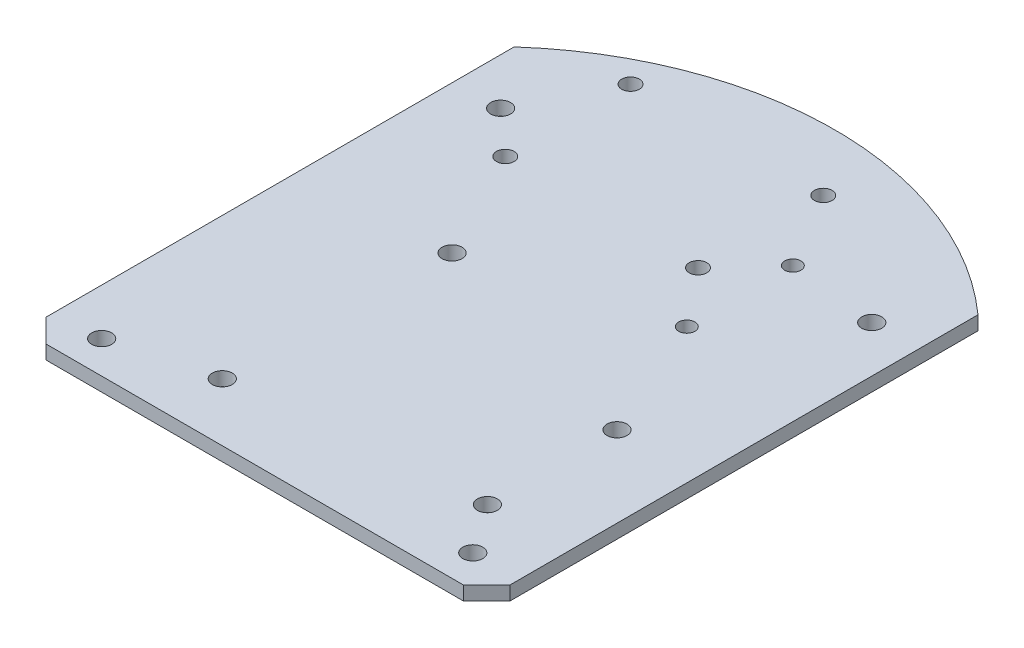
ISO-10303-21;
HEADER;
FILE_DESCRIPTION(('STEP AP214'),'2;1');
FILE_NAME('part.step','',(''),(''),'','','');
FILE_SCHEMA(('AUTOMOTIVE_DESIGN { 1 0 10303 214 1 1 1 1 }'));
ENDSEC;
DATA;
#1=APPLICATION_CONTEXT('core data for automotive mechanical design processes');
#2=APPLICATION_PROTOCOL_DEFINITION('international standard','automotive_design',2000,#1);
#3=PRODUCT_CONTEXT('',#1,'mechanical');
#4=PRODUCT('Part','Part','',(#3));
#5=PRODUCT_RELATED_PRODUCT_CATEGORY('part','',(#4));
#6=PRODUCT_DEFINITION_FORMATION('','',#4);
#7=PRODUCT_DEFINITION_CONTEXT('part definition',#1,'design');
#8=PRODUCT_DEFINITION('design','',#6,#7);
#9=PRODUCT_DEFINITION_SHAPE('','',#8);
#10=(LENGTH_UNIT() NAMED_UNIT(*) SI_UNIT(.MILLI.,.METRE.));
#11=(NAMED_UNIT(*) PLANE_ANGLE_UNIT() SI_UNIT($,.RADIAN.));
#12=(NAMED_UNIT(*) SI_UNIT($,.STERADIAN.) SOLID_ANGLE_UNIT());
#13=UNCERTAINTY_MEASURE_WITH_UNIT(LENGTH_MEASURE(1.E-05),#10,'distance_accuracy_value','');
#14=(GEOMETRIC_REPRESENTATION_CONTEXT(3) GLOBAL_UNCERTAINTY_ASSIGNED_CONTEXT((#13)) GLOBAL_UNIT_ASSIGNED_CONTEXT((#10,
#11,#12)) REPRESENTATION_CONTEXT('',''));
#15=CARTESIAN_POINT('',(0.,0.,0.));
#16=DIRECTION('',(0.,0.,1.));
#17=DIRECTION('',(1.,0.,0.));
#18=AXIS2_PLACEMENT_3D('',#15,#16,#17);
#19=CARTESIAN_POINT('',(-50.,3.,50.));
#20=DIRECTION('',(1.,0.,0.));
#21=DIRECTION('',(0.,0.,-1.));
#22=AXIS2_PLACEMENT_3D('',#19,#20,#21);
#23=PLANE('',#22);
#24=DIRECTION('',(0.,0.,1.));
#25=VECTOR('',#24,1.);
#26=CARTESIAN_POINT('',(-50.,0.,50.));
#27=LINE('',#26,#25);
#28=CARTESIAN_POINT('',(-50.,0.,-55.9016994373041));
#29=VERTEX_POINT('',#28);
#30=CARTESIAN_POINT('',(-50.,0.,45.));
#31=VERTEX_POINT('',#30);
#32=EDGE_CURVE('E138',#29,#31,#27,.T.);
#33=ORIENTED_EDGE('',*,*,#32,.T.);
#34=DIRECTION('',(0.,1.,0.));
#35=VECTOR('',#34,1.);
#36=CARTESIAN_POINT('',(-50.,3.,45.));
#37=LINE('',#36,#35);
#38=CARTESIAN_POINT('',(-50.,3.,45.));
#39=VERTEX_POINT('',#38);
#40=EDGE_CURVE('E92',#31,#39,#37,.T.);
#41=ORIENTED_EDGE('',*,*,#40,.T.);
#42=DIRECTION('',(0.,0.,1.));
#43=VECTOR('',#42,1.);
#44=CARTESIAN_POINT('',(-50.,3.,50.));
#45=LINE('',#44,#43);
#46=CARTESIAN_POINT('',(-50.,3.,-55.9016994373041));
#47=VERTEX_POINT('',#46);
#48=EDGE_CURVE('E132',#47,#39,#45,.T.);
#49=ORIENTED_EDGE('',*,*,#48,.F.);
#50=DIRECTION('',(0.,1.,0.));
#51=VECTOR('',#50,1.);
#52=CARTESIAN_POINT('',(-50.,-104.403065089049,-55.9016994373041));
#53=LINE('',#52,#51);
#54=EDGE_CURVE('E146',#29,#47,#53,.T.);
#55=ORIENTED_EDGE('',*,*,#54,.F.);
#56=EDGE_LOOP('',(#33,#41,#49,#55));
#57=FACE_BOUND('',#56,.T.);
#58=ADVANCED_FACE('F68',(#57),#23,.F.);
#59=CARTESIAN_POINT('',(50.,3.,50.));
#60=DIRECTION('',(0.,0.,-1.));
#61=DIRECTION('',(-1.,0.,0.));
#62=AXIS2_PLACEMENT_3D('',#59,#60,#61);
#63=PLANE('',#62);
#64=DIRECTION('',(1.,0.,0.));
#65=VECTOR('',#64,1.);
#66=CARTESIAN_POINT('',(50.,3.,50.));
#67=LINE('',#66,#65);
#68=CARTESIAN_POINT('',(-45.,3.,50.));
#69=VERTEX_POINT('',#68);
#70=CARTESIAN_POINT('',(45.,3.,50.));
#71=VERTEX_POINT('',#70);
#72=EDGE_CURVE('E155',#69,#71,#67,.T.);
#73=ORIENTED_EDGE('',*,*,#72,.F.);
#74=DIRECTION('',(0.,-1.,0.));
#75=VECTOR('',#74,1.);
#76=CARTESIAN_POINT('',(-45.,3.,50.));
#77=LINE('',#76,#75);
#78=CARTESIAN_POINT('',(-45.,0.,50.));
#79=VERTEX_POINT('',#78);
#80=EDGE_CURVE('E164',#69,#79,#77,.T.);
#81=ORIENTED_EDGE('',*,*,#80,.T.);
#82=DIRECTION('',(1.,0.,0.));
#83=VECTOR('',#82,1.);
#84=CARTESIAN_POINT('',(50.,0.,50.));
#85=LINE('',#84,#83);
#86=CARTESIAN_POINT('',(45.,0.,50.));
#87=VERTEX_POINT('',#86);
#88=EDGE_CURVE('E133',#79,#87,#85,.T.);
#89=ORIENTED_EDGE('',*,*,#88,.T.);
#90=DIRECTION('',(0.,1.,0.));
#91=VECTOR('',#90,1.);
#92=CARTESIAN_POINT('',(45.,3.,50.));
#93=LINE('',#92,#91);
#94=EDGE_CURVE('E159',#87,#71,#93,.T.);
#95=ORIENTED_EDGE('',*,*,#94,.T.);
#96=EDGE_LOOP('',(#73,#81,#89,#95));
#97=FACE_BOUND('',#96,.T.);
#98=ADVANCED_FACE('F178',(#97),#63,.F.);
#99=CARTESIAN_POINT('',(50.,3.,50.));
#100=DIRECTION('',(-1.,0.,0.));
#101=DIRECTION('',(0.,0.,1.));
#102=AXIS2_PLACEMENT_3D('',#99,#100,#101);
#103=PLANE('',#102);
#104=DIRECTION('',(0.,0.,-1.));
#105=VECTOR('',#104,1.);
#106=CARTESIAN_POINT('',(50.,3.,50.));
#107=LINE('',#106,#105);
#108=CARTESIAN_POINT('',(50.,3.,45.));
#109=VERTEX_POINT('',#108);
#110=CARTESIAN_POINT('',(50.,3.,-55.9016994373041));
#111=VERTEX_POINT('',#110);
#112=EDGE_CURVE('E157',#109,#111,#107,.T.);
#113=ORIENTED_EDGE('',*,*,#112,.F.);
#114=DIRECTION('',(0.,-1.,0.));
#115=VECTOR('',#114,1.);
#116=CARTESIAN_POINT('',(50.,3.,45.));
#117=LINE('',#116,#115);
#118=CARTESIAN_POINT('',(50.,0.,45.));
#119=VERTEX_POINT('',#118);
#120=EDGE_CURVE('E12',#109,#119,#117,.T.);
#121=ORIENTED_EDGE('',*,*,#120,.T.);
#122=DIRECTION('',(0.,0.,-1.));
#123=VECTOR('',#122,1.);
#124=CARTESIAN_POINT('',(50.,0.,50.));
#125=LINE('',#124,#123);
#126=CARTESIAN_POINT('',(50.,0.,-55.9016994373041));
#127=VERTEX_POINT('',#126);
#128=EDGE_CURVE('E124',#119,#127,#125,.T.);
#129=ORIENTED_EDGE('',*,*,#128,.T.);
#130=DIRECTION('',(0.,1.,0.));
#131=VECTOR('',#130,1.);
#132=CARTESIAN_POINT('',(50.,-104.403065089049,-55.9016994373041));
#133=LINE('',#132,#131);
#134=EDGE_CURVE('E128',#127,#111,#133,.T.);
#135=ORIENTED_EDGE('',*,*,#134,.T.);
#136=EDGE_LOOP('',(#113,#121,#129,#135));
#137=FACE_BOUND('',#136,.T.);
#138=ADVANCED_FACE('F126',(#137),#103,.F.);
#139=CARTESIAN_POINT('',(0.,3.,0.));
#140=DIRECTION('',(0.,1.,0.));
#141=DIRECTION('',(0.,0.,1.));
#142=AXIS2_PLACEMENT_3D('',#139,#140,#141);
#143=PLANE('',#142);
#144=CARTESIAN_POINT('',(20.8552200520717,3.,-45.1290611241877));
#145=DIRECTION('',(0.,1.,0.));
#146=DIRECTION('',(0.,0.,1.));
#147=AXIS2_PLACEMENT_3D('',#144,#145,#146);
#148=CIRCLE('',#147,1.75);
#149=CARTESIAN_POINT('',(20.8552200520717,3.,-43.3790611241877));
#150=VERTEX_POINT('',#149);
#151=EDGE_CURVE('E256',#150,#150,#148,.T.);
#152=ORIENTED_EDGE('',*,*,#151,.F.);
#153=EDGE_LOOP('',(#152));
#154=FACE_BOUND('',#153,.T.);
#155=CARTESIAN_POINT('',(20.8341093585457,3.,-22.2973617608194));
#156=DIRECTION('',(0.,1.,0.));
#157=DIRECTION('',(0.,0.,1.));
#158=AXIS2_PLACEMENT_3D('',#155,#156,#157);
#159=CIRCLE('',#158,1.75);
#160=CARTESIAN_POINT('',(20.8341093585457,3.,-20.5473617608194));
#161=VERTEX_POINT('',#160);
#162=EDGE_CURVE('E253',#161,#161,#159,.T.);
#163=ORIENTED_EDGE('',*,*,#162,.F.);
#164=EDGE_LOOP('',(#163));
#165=FACE_BOUND('',#164,.T.);
#166=CARTESIAN_POINT('',(32.57,3.,4.47999999999998));
#167=DIRECTION('',(0.,1.,0.));
#168=DIRECTION('',(0.,0.,1.));
#169=AXIS2_PLACEMENT_3D('',#166,#167,#168);
#170=CIRCLE('',#169,2.15000000000001);
#171=CARTESIAN_POINT('',(32.57,3.,6.62999999999999));
#172=VERTEX_POINT('',#171);
#173=EDGE_CURVE('E215',#172,#172,#170,.T.);
#174=ORIENTED_EDGE('',*,*,#173,.F.);
#175=EDGE_LOOP('',(#174));
#176=FACE_BOUND('',#175,.T.);
#177=CARTESIAN_POINT('',(32.57,3.,32.42));
#178=DIRECTION('',(0.,1.,0.));
#179=DIRECTION('',(0.,0.,1.));
#180=AXIS2_PLACEMENT_3D('',#177,#178,#179);
#181=CIRCLE('',#180,2.15000000000001);
#182=CARTESIAN_POINT('',(32.57,3.,34.57));
#183=VERTEX_POINT('',#182);
#184=EDGE_CURVE('E214',#183,#183,#181,.T.);
#185=ORIENTED_EDGE('',*,*,#184,.F.);
#186=EDGE_LOOP('',(#185));
#187=FACE_BOUND('',#186,.T.);
#188=CARTESIAN_POINT('',(40.,3.,43.));
#189=DIRECTION('',(0.,1.,0.));
#190=DIRECTION('',(0.,0.,1.));
#191=AXIS2_PLACEMENT_3D('',#188,#189,#190);
#192=CIRCLE('',#191,2.15000000000001);
#193=CARTESIAN_POINT('',(40.,3.,45.15));
#194=VERTEX_POINT('',#193);
#195=EDGE_CURVE('E222',#194,#194,#192,.T.);
#196=ORIENTED_EDGE('',*,*,#195,.F.);
#197=EDGE_LOOP('',(#196));
#198=FACE_BOUND('',#197,.T.);
#199=CARTESIAN_POINT('',(-40.,3.,43.));
#200=DIRECTION('',(0.,1.,0.));
#201=DIRECTION('',(0.,0.,1.));
#202=AXIS2_PLACEMENT_3D('',#199,#200,#201);
#203=CIRCLE('',#202,2.15000000000001);
#204=CARTESIAN_POINT('',(-40.,3.,45.15));
#205=VERTEX_POINT('',#204);
#206=EDGE_CURVE('E228',#205,#205,#203,.T.);
#207=ORIENTED_EDGE('',*,*,#206,.F.);
#208=EDGE_LOOP('',(#207));
#209=FACE_BOUND('',#208,.T.);
#210=CARTESIAN_POINT('',(-19.5,3.,37.5));
#211=DIRECTION('',(0.,1.,0.));
#212=DIRECTION('',(0.,0.,1.));
#213=AXIS2_PLACEMENT_3D('',#210,#211,#212);
#214=CIRCLE('',#213,2.15);
#215=CARTESIAN_POINT('',(-19.5,3.,39.65));
#216=VERTEX_POINT('',#215);
#217=EDGE_CURVE('E191',#216,#216,#214,.T.);
#218=ORIENTED_EDGE('',*,*,#217,.F.);
#219=EDGE_LOOP('',(#218));
#220=FACE_BOUND('',#219,.T.);
#221=CARTESIAN_POINT('',(-18.23,3.,-10.76));
#222=DIRECTION('',(0.,1.,0.));
#223=DIRECTION('',(0.,0.,1.));
#224=AXIS2_PLACEMENT_3D('',#221,#222,#223);
#225=CIRCLE('',#224,2.15);
#226=CARTESIAN_POINT('',(-18.23,3.,-8.61000000000002));
#227=VERTEX_POINT('',#226);
#228=EDGE_CURVE('E190',#227,#227,#225,.T.);
#229=ORIENTED_EDGE('',*,*,#228,.F.);
#230=EDGE_LOOP('',(#229));
#231=FACE_BOUND('',#230,.T.);
#232=CARTESIAN_POINT('',(-30.500000000207,3.,-34.5000000000003));
#233=DIRECTION('',(0.,1.,0.));
#234=DIRECTION('',(0.,0.,1.));
#235=AXIS2_PLACEMENT_3D('',#232,#233,#234);
#236=CIRCLE('',#235,1.9);
#237=CARTESIAN_POINT('',(-30.500000000207,3.,-32.6000000000003));
#238=VERTEX_POINT('',#237);
#239=EDGE_CURVE('E198',#238,#238,#236,.T.);
#240=ORIENTED_EDGE('',*,*,#239,.F.);
#241=EDGE_LOOP('',(#240));
#242=FACE_BOUND('',#241,.T.);
#243=CARTESIAN_POINT('',(-30.500000000207,3.,-61.5000000000003));
#244=DIRECTION('',(0.,1.,0.));
#245=DIRECTION('',(0.,0.,1.));
#246=AXIS2_PLACEMENT_3D('',#243,#244,#245);
#247=CIRCLE('',#246,1.9);
#248=CARTESIAN_POINT('',(-30.500000000207,3.,-59.6000000000003));
#249=VERTEX_POINT('',#248);
#250=EDGE_CURVE('E204',#249,#249,#247,.T.);
#251=ORIENTED_EDGE('',*,*,#250,.F.);
#252=EDGE_LOOP('',(#251));
#253=FACE_BOUND('',#252,.T.);
#254=CARTESIAN_POINT('',(40.,3.,-43.));
#255=DIRECTION('',(0.,1.,0.));
#256=DIRECTION('',(0.,0.,1.));
#257=AXIS2_PLACEMENT_3D('',#254,#255,#256);
#258=CIRCLE('',#257,2.15000000000001);
#259=CARTESIAN_POINT('',(40.,3.,-40.85));
#260=VERTEX_POINT('',#259);
#261=EDGE_CURVE('E246',#260,#260,#258,.T.);
#262=ORIENTED_EDGE('',*,*,#261,.F.);
#263=EDGE_LOOP('',(#262));
#264=FACE_BOUND('',#263,.T.);
#265=CARTESIAN_POINT('',(11.049999999793,3.,-34.5000000000003));
#266=DIRECTION('',(0.,1.,0.));
#267=DIRECTION('',(0.,0.,1.));
#268=AXIS2_PLACEMENT_3D('',#265,#266,#267);
#269=CIRCLE('',#268,1.9);
#270=CARTESIAN_POINT('',(11.049999999793,3.,-32.6000000000003));
#271=VERTEX_POINT('',#270);
#272=EDGE_CURVE('E238',#271,#271,#269,.T.);
#273=ORIENTED_EDGE('',*,*,#272,.F.);
#274=EDGE_LOOP('',(#273));
#275=FACE_BOUND('',#274,.T.);
#276=CARTESIAN_POINT('',(11.049999999793,3.,-61.5000000000003));
#277=DIRECTION('',(0.,1.,0.));
#278=DIRECTION('',(0.,0.,1.));
#279=AXIS2_PLACEMENT_3D('',#276,#277,#278);
#280=CIRCLE('',#279,1.9);
#281=CARTESIAN_POINT('',(11.049999999793,3.,-59.6000000000003));
#282=VERTEX_POINT('',#281);
#283=EDGE_CURVE('E239',#282,#282,#280,.T.);
#284=ORIENTED_EDGE('',*,*,#283,.F.);
#285=EDGE_LOOP('',(#284));
#286=FACE_BOUND('',#285,.T.);
#287=CARTESIAN_POINT('',(-40.,3.,-43.));
#288=DIRECTION('',(0.,1.,0.));
#289=DIRECTION('',(0.,0.,1.));
#290=AXIS2_PLACEMENT_3D('',#287,#288,#289);
#291=CIRCLE('',#290,2.15000000000001);
#292=CARTESIAN_POINT('',(-40.,3.,-40.85));
#293=VERTEX_POINT('',#292);
#294=EDGE_CURVE('E151',#293,#293,#291,.T.);
#295=ORIENTED_EDGE('',*,*,#294,.F.);
#296=EDGE_LOOP('',(#295));
#297=FACE_BOUND('',#296,.T.);
#298=ORIENTED_EDGE('',*,*,#48,.T.);
#299=DIRECTION('',(-0.707106781186547,0.,-0.707106781186549));
#300=VECTOR('',#299,1.);
#301=CARTESIAN_POINT('',(-47.5000000000001,3.,47.4999999999999));
#302=LINE('',#301,#300);
#303=EDGE_CURVE('E77',#39,#69,#302,.F.);
#304=ORIENTED_EDGE('',*,*,#303,.T.);
#305=ORIENTED_EDGE('',*,*,#72,.T.);
#306=DIRECTION('',(-0.707106781186549,0.,0.707106781186547));
#307=VECTOR('',#306,1.);
#308=CARTESIAN_POINT('',(47.4999999999999,3.,47.5000000000001));
#309=LINE('',#308,#307);
#310=EDGE_CURVE('E84',#71,#109,#309,.F.);
#311=ORIENTED_EDGE('',*,*,#310,.T.);
#312=ORIENTED_EDGE('',*,*,#112,.T.);
#313=CARTESIAN_POINT('',(0.,3.,2.11983208764366E-10));
#314=DIRECTION('',(0.,1.,0.));
#315=DIRECTION('',(0.,0.,1.));
#316=AXIS2_PLACEMENT_3D('',#313,#314,#315);
#317=CIRCLE('',#316,75.0000000000159);
#318=EDGE_CURVE('E142',#111,#47,#317,.T.);
#319=ORIENTED_EDGE('',*,*,#318,.T.);
#320=EDGE_LOOP('',(#298,#304,#305,#311,#312,#319));
#321=FACE_BOUND('',#320,.T.);
#322=ADVANCED_FACE('F174',(#154,#165,#176,#187,#198,#209,#220,#231,#242,#253,#264,#275,#286,
#297,#321),#143,.T.);
#323=CARTESIAN_POINT('',(0.,0.,0.));
#324=DIRECTION('',(0.,1.,0.));
#325=DIRECTION('',(0.,0.,1.));
#326=AXIS2_PLACEMENT_3D('',#323,#324,#325);
#327=PLANE('',#326);
#328=CARTESIAN_POINT('',(20.8552200520717,0.,-45.1290611241877));
#329=DIRECTION('',(0.,1.,0.));
#330=DIRECTION('',(0.,0.,1.));
#331=AXIS2_PLACEMENT_3D('',#328,#329,#330);
#332=CIRCLE('',#331,1.75);
#333=CARTESIAN_POINT('',(20.8552200520717,0.,-43.3790611241877));
#334=VERTEX_POINT('',#333);
#335=EDGE_CURVE('E242',#334,#334,#332,.F.);
#336=ORIENTED_EDGE('',*,*,#335,.F.);
#337=EDGE_LOOP('',(#336));
#338=FACE_BOUND('',#337,.T.);
#339=CARTESIAN_POINT('',(20.8341093585457,0.,-22.2973617608194));
#340=DIRECTION('',(0.,1.,0.));
#341=DIRECTION('',(0.,0.,1.));
#342=AXIS2_PLACEMENT_3D('',#339,#340,#341);
#343=CIRCLE('',#342,1.75);
#344=CARTESIAN_POINT('',(20.8341093585457,0.,-20.5473617608194));
#345=VERTEX_POINT('',#344);
#346=EDGE_CURVE('E257',#345,#345,#343,.F.);
#347=ORIENTED_EDGE('',*,*,#346,.F.);
#348=EDGE_LOOP('',(#347));
#349=FACE_BOUND('',#348,.T.);
#350=CARTESIAN_POINT('',(32.57,0.,4.47999999999998));
#351=DIRECTION('',(0.,1.,0.));
#352=DIRECTION('',(0.,0.,1.));
#353=AXIS2_PLACEMENT_3D('',#350,#351,#352);
#354=CIRCLE('',#353,2.15000000000001);
#355=CARTESIAN_POINT('',(32.57,0.,6.62999999999999));
#356=VERTEX_POINT('',#355);
#357=EDGE_CURVE('E211',#356,#356,#354,.F.);
#358=ORIENTED_EDGE('',*,*,#357,.F.);
#359=EDGE_LOOP('',(#358));
#360=FACE_BOUND('',#359,.T.);
#361=CARTESIAN_POINT('',(32.57,0.,32.42));
#362=DIRECTION('',(0.,1.,0.));
#363=DIRECTION('',(0.,0.,1.));
#364=AXIS2_PLACEMENT_3D('',#361,#362,#363);
#365=CIRCLE('',#364,2.15000000000001);
#366=CARTESIAN_POINT('',(32.57,0.,34.57));
#367=VERTEX_POINT('',#366);
#368=EDGE_CURVE('E219',#367,#367,#365,.F.);
#369=ORIENTED_EDGE('',*,*,#368,.F.);
#370=EDGE_LOOP('',(#369));
#371=FACE_BOUND('',#370,.T.);
#372=CARTESIAN_POINT('',(40.,0.,43.));
#373=DIRECTION('',(0.,1.,0.));
#374=DIRECTION('',(0.,0.,1.));
#375=AXIS2_PLACEMENT_3D('',#372,#373,#374);
#376=CIRCLE('',#375,2.15000000000001);
#377=CARTESIAN_POINT('',(40.,0.,45.15));
#378=VERTEX_POINT('',#377);
#379=EDGE_CURVE('E225',#378,#378,#376,.F.);
#380=ORIENTED_EDGE('',*,*,#379,.F.);
#381=EDGE_LOOP('',(#380));
#382=FACE_BOUND('',#381,.T.);
#383=CARTESIAN_POINT('',(-40.,0.,43.));
#384=DIRECTION('',(0.,1.,0.));
#385=DIRECTION('',(0.,0.,1.));
#386=AXIS2_PLACEMENT_3D('',#383,#384,#385);
#387=CIRCLE('',#386,2.15000000000001);
#388=CARTESIAN_POINT('',(-40.,0.,45.15));
#389=VERTEX_POINT('',#388);
#390=EDGE_CURVE('E194',#389,#389,#387,.F.);
#391=ORIENTED_EDGE('',*,*,#390,.F.);
#392=EDGE_LOOP('',(#391));
#393=FACE_BOUND('',#392,.T.);
#394=CARTESIAN_POINT('',(-19.5,0.,37.5));
#395=DIRECTION('',(0.,1.,0.));
#396=DIRECTION('',(0.,0.,1.));
#397=AXIS2_PLACEMENT_3D('',#394,#395,#396);
#398=CIRCLE('',#397,2.15);
#399=CARTESIAN_POINT('',(-19.5,0.,39.65));
#400=VERTEX_POINT('',#399);
#401=EDGE_CURVE('E187',#400,#400,#398,.F.);
#402=ORIENTED_EDGE('',*,*,#401,.F.);
#403=EDGE_LOOP('',(#402));
#404=FACE_BOUND('',#403,.T.);
#405=CARTESIAN_POINT('',(-18.23,0.,-10.76));
#406=DIRECTION('',(0.,1.,0.));
#407=DIRECTION('',(0.,0.,1.));
#408=AXIS2_PLACEMENT_3D('',#405,#406,#407);
#409=CIRCLE('',#408,2.15);
#410=CARTESIAN_POINT('',(-18.23,0.,-8.61000000000002));
#411=VERTEX_POINT('',#410);
#412=EDGE_CURVE('E195',#411,#411,#409,.F.);
#413=ORIENTED_EDGE('',*,*,#412,.F.);
#414=EDGE_LOOP('',(#413));
#415=FACE_BOUND('',#414,.T.);
#416=CARTESIAN_POINT('',(-30.500000000207,0.,-34.5000000000003));
#417=DIRECTION('',(0.,1.,0.));
#418=DIRECTION('',(0.,0.,1.));
#419=AXIS2_PLACEMENT_3D('',#416,#417,#418);
#420=CIRCLE('',#419,1.9);
#421=CARTESIAN_POINT('',(-30.500000000207,0.,-32.6000000000003));
#422=VERTEX_POINT('',#421);
#423=EDGE_CURVE('E201',#422,#422,#420,.F.);
#424=ORIENTED_EDGE('',*,*,#423,.F.);
#425=EDGE_LOOP('',(#424));
#426=FACE_BOUND('',#425,.T.);
#427=CARTESIAN_POINT('',(-30.500000000207,0.,-61.5000000000003));
#428=DIRECTION('',(0.,1.,0.));
#429=DIRECTION('',(0.,0.,1.));
#430=AXIS2_PLACEMENT_3D('',#427,#428,#429);
#431=CIRCLE('',#430,1.9);
#432=CARTESIAN_POINT('',(-30.500000000207,0.,-59.6000000000003));
#433=VERTEX_POINT('',#432);
#434=EDGE_CURVE('E186',#433,#433,#431,.F.);
#435=ORIENTED_EDGE('',*,*,#434,.F.);
#436=EDGE_LOOP('',(#435));
#437=FACE_BOUND('',#436,.T.);
#438=CARTESIAN_POINT('',(40.,0.,-43.));
#439=DIRECTION('',(0.,1.,0.));
#440=DIRECTION('',(0.,0.,1.));
#441=AXIS2_PLACEMENT_3D('',#438,#439,#440);
#442=CIRCLE('',#441,2.15000000000001);
#443=CARTESIAN_POINT('',(40.,0.,-40.85));
#444=VERTEX_POINT('',#443);
#445=EDGE_CURVE('E218',#444,#444,#442,.F.);
#446=ORIENTED_EDGE('',*,*,#445,.F.);
#447=EDGE_LOOP('',(#446));
#448=FACE_BOUND('',#447,.T.);
#449=CARTESIAN_POINT('',(11.049999999793,0.,-34.5000000000003));
#450=DIRECTION('',(0.,1.,0.));
#451=DIRECTION('',(0.,0.,1.));
#452=AXIS2_PLACEMENT_3D('',#449,#450,#451);
#453=CIRCLE('',#452,1.9);
#454=CARTESIAN_POINT('',(11.049999999793,0.,-32.6000000000003));
#455=VERTEX_POINT('',#454);
#456=EDGE_CURVE('E243',#455,#455,#453,.F.);
#457=ORIENTED_EDGE('',*,*,#456,.F.);
#458=EDGE_LOOP('',(#457));
#459=FACE_BOUND('',#458,.T.);
#460=CARTESIAN_POINT('',(11.049999999793,0.,-61.5000000000003));
#461=DIRECTION('',(0.,1.,0.));
#462=DIRECTION('',(0.,0.,1.));
#463=AXIS2_PLACEMENT_3D('',#460,#461,#462);
#464=CIRCLE('',#463,1.9);
#465=CARTESIAN_POINT('',(11.049999999793,0.,-59.6000000000003));
#466=VERTEX_POINT('',#465);
#467=EDGE_CURVE('E235',#466,#466,#464,.F.);
#468=ORIENTED_EDGE('',*,*,#467,.F.);
#469=EDGE_LOOP('',(#468));
#470=FACE_BOUND('',#469,.T.);
#471=CARTESIAN_POINT('',(-40.,0.,-43.));
#472=DIRECTION('',(0.,1.,0.));
#473=DIRECTION('',(0.,0.,1.));
#474=AXIS2_PLACEMENT_3D('',#471,#472,#473);
#475=CIRCLE('',#474,2.15000000000001);
#476=CARTESIAN_POINT('',(-40.,0.,-40.85));
#477=VERTEX_POINT('',#476);
#478=EDGE_CURVE('E147',#477,#477,#475,.F.);
#479=ORIENTED_EDGE('',*,*,#478,.F.);
#480=EDGE_LOOP('',(#479));
#481=FACE_BOUND('',#480,.T.);
#482=CARTESIAN_POINT('',(0.,0.,2.11983208764366E-10));
#483=DIRECTION('',(0.,1.,0.));
#484=DIRECTION('',(0.,0.,1.));
#485=AXIS2_PLACEMENT_3D('',#482,#483,#484);
#486=CIRCLE('',#485,75.0000000000159);
#487=EDGE_CURVE('E136',#29,#127,#486,.F.);
#488=ORIENTED_EDGE('',*,*,#487,.T.);
#489=ORIENTED_EDGE('',*,*,#128,.F.);
#490=DIRECTION('',(0.707106781186549,0.,-0.707106781186547));
#491=VECTOR('',#490,1.);
#492=CARTESIAN_POINT('',(50.,0.,45.));
#493=LINE('',#492,#491);
#494=EDGE_CURVE('E167',#119,#87,#493,.F.);
#495=ORIENTED_EDGE('',*,*,#494,.T.);
#496=ORIENTED_EDGE('',*,*,#88,.F.);
#497=DIRECTION('',(0.707106781186547,0.,0.707106781186549));
#498=VECTOR('',#497,1.);
#499=CARTESIAN_POINT('',(-45.,0.,50.));
#500=LINE('',#499,#498);
#501=EDGE_CURVE('E169',#79,#31,#500,.F.);
#502=ORIENTED_EDGE('',*,*,#501,.T.);
#503=ORIENTED_EDGE('',*,*,#32,.F.);
#504=EDGE_LOOP('',(#488,#489,#495,#496,#502,#503));
#505=FACE_BOUND('',#504,.T.);
#506=ADVANCED_FACE('F137',(#338,#349,#360,#371,#382,#393,#404,#415,#426,#437,#448,#459,#470,
#481,#505),#327,.F.);
#507=CARTESIAN_POINT('',(-45.,3.,50.));
#508=DIRECTION('',(0.707106781186548,0.,-0.707106781186546));
#509=DIRECTION('',(0.,-1.,0.));
#510=AXIS2_PLACEMENT_3D('',#507,#508,#509);
#511=PLANE('',#510);
#512=ORIENTED_EDGE('',*,*,#303,.F.);
#513=ORIENTED_EDGE('',*,*,#40,.F.);
#514=ORIENTED_EDGE('',*,*,#501,.F.);
#515=ORIENTED_EDGE('',*,*,#80,.F.);
#516=EDGE_LOOP('',(#512,#513,#514,#515));
#517=FACE_BOUND('',#516,.T.);
#518=ADVANCED_FACE('F181',(#517),#511,.F.);
#519=CARTESIAN_POINT('',(50.,3.,45.));
#520=DIRECTION('',(-0.707106781186546,0.,-0.707106781186548));
#521=DIRECTION('',(0.,-1.,0.));
#522=AXIS2_PLACEMENT_3D('',#519,#520,#521);
#523=PLANE('',#522);
#524=ORIENTED_EDGE('',*,*,#310,.F.);
#525=ORIENTED_EDGE('',*,*,#94,.F.);
#526=ORIENTED_EDGE('',*,*,#494,.F.);
#527=ORIENTED_EDGE('',*,*,#120,.F.);
#528=EDGE_LOOP('',(#524,#525,#526,#527));
#529=FACE_BOUND('',#528,.T.);
#530=ADVANCED_FACE('F71',(#529),#523,.F.);
#531=CARTESIAN_POINT('',(0.,-104.403065089049,2.11983208764366E-10));
#532=DIRECTION('',(0.,1.,0.));
#533=DIRECTION('',(0.,0.,1.));
#534=AXIS2_PLACEMENT_3D('',#531,#532,#533);
#535=CYLINDRICAL_SURFACE('',#534,75.0000000000159);
#536=ORIENTED_EDGE('',*,*,#487,.F.);
#537=ORIENTED_EDGE('',*,*,#54,.T.);
#538=ORIENTED_EDGE('',*,*,#318,.F.);
#539=ORIENTED_EDGE('',*,*,#134,.F.);
#540=EDGE_LOOP('',(#536,#537,#538,#539));
#541=FACE_BOUND('',#540,.T.);
#542=ADVANCED_FACE('F144',(#541),#535,.T.);
#543=CARTESIAN_POINT('',(-40.,-6.08111831820433,-43.));
#544=DIRECTION('',(0.,1.,0.));
#545=DIRECTION('',(0.,0.,1.));
#546=AXIS2_PLACEMENT_3D('',#543,#544,#545);
#547=CYLINDRICAL_SURFACE('',#546,2.15000000000001);
#548=ORIENTED_EDGE('',*,*,#478,.T.);
#549=EDGE_LOOP('',(#548));
#550=FACE_BOUND('',#549,.T.);
#551=ORIENTED_EDGE('',*,*,#294,.T.);
#552=EDGE_LOOP('',(#551));
#553=FACE_BOUND('',#552,.T.);
#554=ADVANCED_FACE('F296',(#550,#553),#547,.F.);
#555=CARTESIAN_POINT('',(11.049999999793,-6.08111831820433,-61.5000000000003));
#556=DIRECTION('',(0.,1.,0.));
#557=DIRECTION('',(0.,0.,1.));
#558=AXIS2_PLACEMENT_3D('',#555,#556,#557);
#559=CYLINDRICAL_SURFACE('',#558,1.9);
#560=ORIENTED_EDGE('',*,*,#467,.T.);
#561=EDGE_LOOP('',(#560));
#562=FACE_BOUND('',#561,.T.);
#563=ORIENTED_EDGE('',*,*,#283,.T.);
#564=EDGE_LOOP('',(#563));
#565=FACE_BOUND('',#564,.T.);
#566=ADVANCED_FACE('F298',(#562,#565),#559,.F.);
#567=CARTESIAN_POINT('',(11.049999999793,-6.08111831820433,-34.5000000000003));
#568=DIRECTION('',(0.,1.,0.));
#569=DIRECTION('',(0.,0.,1.));
#570=AXIS2_PLACEMENT_3D('',#567,#568,#569);
#571=CYLINDRICAL_SURFACE('',#570,1.9);
#572=ORIENTED_EDGE('',*,*,#456,.T.);
#573=EDGE_LOOP('',(#572));
#574=FACE_BOUND('',#573,.T.);
#575=ORIENTED_EDGE('',*,*,#272,.T.);
#576=EDGE_LOOP('',(#575));
#577=FACE_BOUND('',#576,.T.);
#578=ADVANCED_FACE('F305',(#574,#577),#571,.F.);
#579=CARTESIAN_POINT('',(40.,-6.08111831820433,-43.));
#580=DIRECTION('',(0.,1.,0.));
#581=DIRECTION('',(0.,0.,1.));
#582=AXIS2_PLACEMENT_3D('',#579,#580,#581);
#583=CYLINDRICAL_SURFACE('',#582,2.15000000000001);
#584=ORIENTED_EDGE('',*,*,#445,.T.);
#585=EDGE_LOOP('',(#584));
#586=FACE_BOUND('',#585,.T.);
#587=ORIENTED_EDGE('',*,*,#261,.T.);
#588=EDGE_LOOP('',(#587));
#589=FACE_BOUND('',#588,.T.);
#590=ADVANCED_FACE('F379',(#586,#589),#583,.F.);
#591=CARTESIAN_POINT('',(-30.500000000207,-6.08111831820433,-61.5000000000003));
#592=DIRECTION('',(0.,1.,0.));
#593=DIRECTION('',(0.,0.,1.));
#594=AXIS2_PLACEMENT_3D('',#591,#592,#593);
#595=CYLINDRICAL_SURFACE('',#594,1.9);
#596=ORIENTED_EDGE('',*,*,#434,.T.);
#597=EDGE_LOOP('',(#596));
#598=FACE_BOUND('',#597,.T.);
#599=ORIENTED_EDGE('',*,*,#250,.T.);
#600=EDGE_LOOP('',(#599));
#601=FACE_BOUND('',#600,.T.);
#602=ADVANCED_FACE('F382',(#598,#601),#595,.F.);
#603=CARTESIAN_POINT('',(-30.500000000207,-6.08111831820433,-34.5000000000003));
#604=DIRECTION('',(0.,1.,0.));
#605=DIRECTION('',(0.,0.,1.));
#606=AXIS2_PLACEMENT_3D('',#603,#604,#605);
#607=CYLINDRICAL_SURFACE('',#606,1.9);
#608=ORIENTED_EDGE('',*,*,#423,.T.);
#609=EDGE_LOOP('',(#608));
#610=FACE_BOUND('',#609,.T.);
#611=ORIENTED_EDGE('',*,*,#239,.T.);
#612=EDGE_LOOP('',(#611));
#613=FACE_BOUND('',#612,.T.);
#614=ADVANCED_FACE('F404',(#610,#613),#607,.F.);
#615=CARTESIAN_POINT('',(-18.23,-6.08111831820433,-10.76));
#616=DIRECTION('',(0.,1.,0.));
#617=DIRECTION('',(0.,0.,1.));
#618=AXIS2_PLACEMENT_3D('',#615,#616,#617);
#619=CYLINDRICAL_SURFACE('',#618,2.15);
#620=ORIENTED_EDGE('',*,*,#412,.T.);
#621=EDGE_LOOP('',(#620));
#622=FACE_BOUND('',#621,.T.);
#623=ORIENTED_EDGE('',*,*,#228,.T.);
#624=EDGE_LOOP('',(#623));
#625=FACE_BOUND('',#624,.T.);
#626=ADVANCED_FACE('F408',(#622,#625),#619,.F.);
#627=CARTESIAN_POINT('',(-19.5,-6.08111831820433,37.5));
#628=DIRECTION('',(0.,1.,0.));
#629=DIRECTION('',(0.,0.,1.));
#630=AXIS2_PLACEMENT_3D('',#627,#628,#629);
#631=CYLINDRICAL_SURFACE('',#630,2.15);
#632=ORIENTED_EDGE('',*,*,#401,.T.);
#633=EDGE_LOOP('',(#632));
#634=FACE_BOUND('',#633,.T.);
#635=ORIENTED_EDGE('',*,*,#217,.T.);
#636=EDGE_LOOP('',(#635));
#637=FACE_BOUND('',#636,.T.);
#638=ADVANCED_FACE('F391',(#634,#637),#631,.F.);
#639=CARTESIAN_POINT('',(-40.,-6.08111831820433,43.));
#640=DIRECTION('',(0.,1.,0.));
#641=DIRECTION('',(0.,0.,1.));
#642=AXIS2_PLACEMENT_3D('',#639,#640,#641);
#643=CYLINDRICAL_SURFACE('',#642,2.15000000000001);
#644=ORIENTED_EDGE('',*,*,#390,.T.);
#645=EDGE_LOOP('',(#644));
#646=FACE_BOUND('',#645,.T.);
#647=ORIENTED_EDGE('',*,*,#206,.T.);
#648=EDGE_LOOP('',(#647));
#649=FACE_BOUND('',#648,.T.);
#650=ADVANCED_FACE('F387',(#646,#649),#643,.F.);
#651=CARTESIAN_POINT('',(40.,-6.08111831820433,43.));
#652=DIRECTION('',(0.,1.,0.));
#653=DIRECTION('',(0.,0.,1.));
#654=AXIS2_PLACEMENT_3D('',#651,#652,#653);
#655=CYLINDRICAL_SURFACE('',#654,2.15000000000001);
#656=ORIENTED_EDGE('',*,*,#379,.T.);
#657=EDGE_LOOP('',(#656));
#658=FACE_BOUND('',#657,.T.);
#659=ORIENTED_EDGE('',*,*,#195,.T.);
#660=EDGE_LOOP('',(#659));
#661=FACE_BOUND('',#660,.T.);
#662=ADVANCED_FACE('F390',(#658,#661),#655,.F.);
#663=CARTESIAN_POINT('',(32.57,-6.08111831820433,32.42));
#664=DIRECTION('',(0.,1.,0.));
#665=DIRECTION('',(0.,0.,1.));
#666=AXIS2_PLACEMENT_3D('',#663,#664,#665);
#667=CYLINDRICAL_SURFACE('',#666,2.15000000000001);
#668=ORIENTED_EDGE('',*,*,#368,.T.);
#669=EDGE_LOOP('',(#668));
#670=FACE_BOUND('',#669,.T.);
#671=ORIENTED_EDGE('',*,*,#184,.T.);
#672=EDGE_LOOP('',(#671));
#673=FACE_BOUND('',#672,.T.);
#674=ADVANCED_FACE('F395',(#670,#673),#667,.F.);
#675=CARTESIAN_POINT('',(32.57,-6.08111831820433,4.47999999999998));
#676=DIRECTION('',(0.,1.,0.));
#677=DIRECTION('',(0.,0.,1.));
#678=AXIS2_PLACEMENT_3D('',#675,#676,#677);
#679=CYLINDRICAL_SURFACE('',#678,2.15000000000001);
#680=ORIENTED_EDGE('',*,*,#357,.T.);
#681=EDGE_LOOP('',(#680));
#682=FACE_BOUND('',#681,.T.);
#683=ORIENTED_EDGE('',*,*,#173,.T.);
#684=EDGE_LOOP('',(#683));
#685=FACE_BOUND('',#684,.T.);
#686=ADVANCED_FACE('F349',(#682,#685),#679,.F.);
#687=CARTESIAN_POINT('',(20.8341093585457,-4.94974746830584,-22.2973617608194));
#688=DIRECTION('',(0.,1.,0.));
#689=DIRECTION('',(0.,0.,1.));
#690=AXIS2_PLACEMENT_3D('',#687,#688,#689);
#691=CYLINDRICAL_SURFACE('',#690,1.75);
#692=ORIENTED_EDGE('',*,*,#346,.T.);
#693=EDGE_LOOP('',(#692));
#694=FACE_BOUND('',#693,.T.);
#695=ORIENTED_EDGE('',*,*,#162,.T.);
#696=EDGE_LOOP('',(#695));
#697=FACE_BOUND('',#696,.T.);
#698=ADVANCED_FACE('F360',(#694,#697),#691,.F.);
#699=CARTESIAN_POINT('',(20.8552200520717,-4.94974746830584,-45.1290611241877));
#700=DIRECTION('',(0.,1.,0.));
#701=DIRECTION('',(0.,0.,1.));
#702=AXIS2_PLACEMENT_3D('',#699,#700,#701);
#703=CYLINDRICAL_SURFACE('',#702,1.75);
#704=ORIENTED_EDGE('',*,*,#335,.T.);
#705=EDGE_LOOP('',(#704));
#706=FACE_BOUND('',#705,.T.);
#707=ORIENTED_EDGE('',*,*,#151,.T.);
#708=EDGE_LOOP('',(#707));
#709=FACE_BOUND('',#708,.T.);
#710=ADVANCED_FACE('F265',(#706,#709),#703,.F.);
#711=CLOSED_SHELL('',(#58,#98,#138,#322,#506,#518,#530,#542,#554,#566,#578,#590,#602,#614,#626,
#638,#650,#662,#674,#686,#698,#710));
#712=MANIFOLD_SOLID_BREP('B2',#711);
#713=ADVANCED_BREP_SHAPE_REPRESENTATION('',(#18,#712),#14);
#714=SHAPE_DEFINITION_REPRESENTATION(#9,#713);
ENDSEC;
END-ISO-10303-21;
